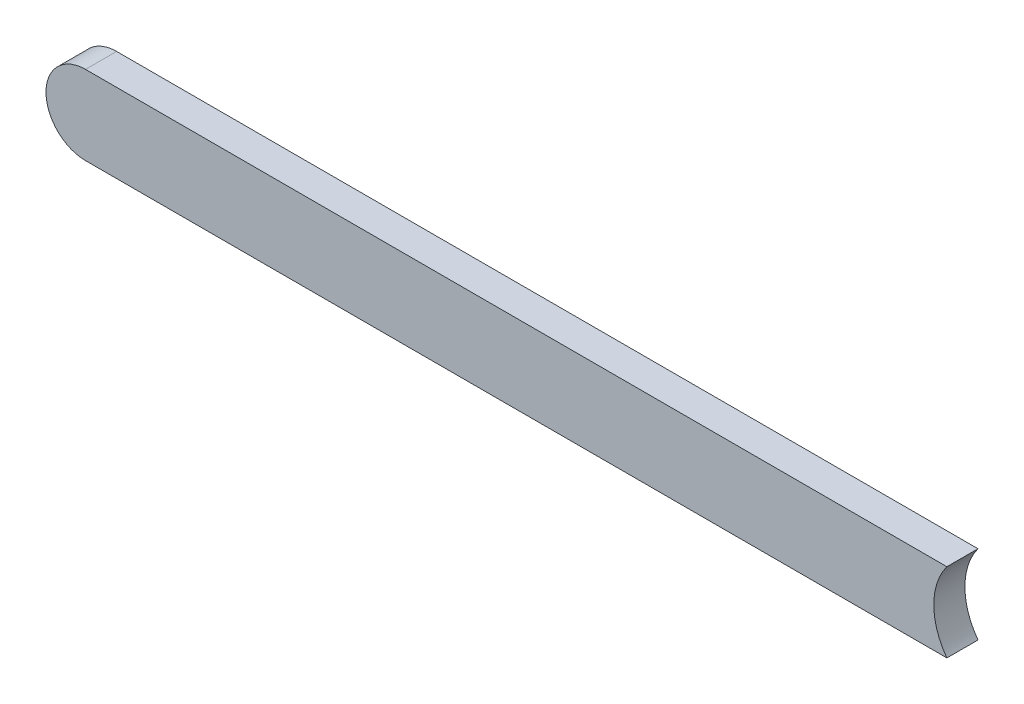
ISO-10303-21;
HEADER;
FILE_DESCRIPTION(('STEP AP214'),'2;1');
FILE_NAME('part.step','',(''),(''),'','','');
FILE_SCHEMA(('AUTOMOTIVE_DESIGN { 1 0 10303 214 1 1 1 1 }'));
ENDSEC;
DATA;
#1=APPLICATION_CONTEXT('core data for automotive mechanical design processes');
#2=APPLICATION_PROTOCOL_DEFINITION('international standard','automotive_design',2000,#1);
#3=PRODUCT_CONTEXT('',#1,'mechanical');
#4=PRODUCT('Part','Part','',(#3));
#5=PRODUCT_RELATED_PRODUCT_CATEGORY('part','',(#4));
#6=PRODUCT_DEFINITION_FORMATION('','',#4);
#7=PRODUCT_DEFINITION_CONTEXT('part definition',#1,'design');
#8=PRODUCT_DEFINITION('design','',#6,#7);
#9=PRODUCT_DEFINITION_SHAPE('','',#8);
#10=(LENGTH_UNIT() NAMED_UNIT(*) SI_UNIT(.MILLI.,.METRE.));
#11=(NAMED_UNIT(*) PLANE_ANGLE_UNIT() SI_UNIT($,.RADIAN.));
#12=(NAMED_UNIT(*) SI_UNIT($,.STERADIAN.) SOLID_ANGLE_UNIT());
#13=UNCERTAINTY_MEASURE_WITH_UNIT(LENGTH_MEASURE(1.E-05),#10,'distance_accuracy_value','');
#14=(GEOMETRIC_REPRESENTATION_CONTEXT(3) GLOBAL_UNCERTAINTY_ASSIGNED_CONTEXT((#13)) GLOBAL_UNIT_ASSIGNED_CONTEXT((#10,
#11,#12)) REPRESENTATION_CONTEXT('',''));
#15=CARTESIAN_POINT('',(0.,0.,0.));
#16=DIRECTION('',(0.,0.,1.));
#17=DIRECTION('',(1.,0.,0.));
#18=AXIS2_PLACEMENT_3D('',#15,#16,#17);
#19=CARTESIAN_POINT('',(143.9814748,58.166,0.));
#20=DIRECTION('',(0.,1.,0.));
#21=DIRECTION('',(1.,0.,0.));
#22=AXIS2_PLACEMENT_3D('',#19,#20,#21);
#23=PLANE('',#22);
#24=DIRECTION('',(1.,0.,0.));
#25=VECTOR('',#24,1.);
#26=CARTESIAN_POINT('',(143.9814748,58.166,0.1999996));
#27=LINE('',#26,#25);
#28=CARTESIAN_POINT('',(143.9814748,58.166,0.1999996));
#29=VERTEX_POINT('',#28);
#30=CARTESIAN_POINT('',(149.519251768896,58.166,0.1999996));
#31=VERTEX_POINT('',#30);
#32=EDGE_CURVE('E11',#29,#31,#27,.T.);
#33=ORIENTED_EDGE('',*,*,#32,.F.);
#34=DIRECTION('',(0.,0.,1.));
#35=VECTOR('',#34,1.);
#36=CARTESIAN_POINT('',(143.9814748,58.166,0.));
#37=LINE('',#36,#35);
#38=CARTESIAN_POINT('',(143.9814748,58.166,0.));
#39=VERTEX_POINT('',#38);
#40=EDGE_CURVE('E24',#39,#29,#37,.T.);
#41=ORIENTED_EDGE('',*,*,#40,.F.);
#42=DIRECTION('',(1.,0.,0.));
#43=VECTOR('',#42,1.);
#44=CARTESIAN_POINT('',(143.9814748,58.166,0.));
#45=LINE('',#44,#43);
#46=CARTESIAN_POINT('',(149.519251768896,58.166,0.));
#47=VERTEX_POINT('',#46);
#48=EDGE_CURVE('E75',#39,#47,#45,.T.);
#49=ORIENTED_EDGE('',*,*,#48,.T.);
#50=DIRECTION('',(0.,0.,1.));
#51=VECTOR('',#50,1.);
#52=CARTESIAN_POINT('',(149.519251768896,58.166,0.));
#53=LINE('',#52,#51);
#54=EDGE_CURVE('E37',#47,#31,#53,.T.);
#55=ORIENTED_EDGE('',*,*,#54,.T.);
#56=EDGE_LOOP('',(#33,#41,#49,#55));
#57=FACE_BOUND('',#56,.T.);
#58=ADVANCED_FACE('F17',(#57),#23,.F.);
#59=CARTESIAN_POINT('',(149.86,58.42,0.));
#60=DIRECTION('',(0.,0.,-1.));
#61=DIRECTION('',(1.,0.,0.));
#62=AXIS2_PLACEMENT_3D('',#59,#60,#61);
#63=CYLINDRICAL_SURFACE('',#62,0.42500042);
#64=DIRECTION('',(0.,0.,1.));
#65=VECTOR('',#64,1.);
#66=CARTESIAN_POINT('',(149.519251768896,58.674,0.));
#67=LINE('',#66,#65);
#68=CARTESIAN_POINT('',(149.519251768896,58.674,0.));
#69=VERTEX_POINT('',#68);
#70=CARTESIAN_POINT('',(149.519251768896,58.674,0.1999996));
#71=VERTEX_POINT('',#70);
#72=EDGE_CURVE('E67',#69,#71,#67,.T.);
#73=ORIENTED_EDGE('',*,*,#72,.T.);
#74=CARTESIAN_POINT('',(149.86,58.42,0.1999996));
#75=DIRECTION('',(0.,0.,1.));
#76=DIRECTION('',(1.,0.,0.));
#77=AXIS2_PLACEMENT_3D('',#74,#75,#76);
#78=CIRCLE('',#77,0.42500042);
#79=EDGE_CURVE('E82',#71,#31,#78,.T.);
#80=ORIENTED_EDGE('',*,*,#79,.T.);
#81=ORIENTED_EDGE('',*,*,#54,.F.);
#82=CARTESIAN_POINT('',(149.86,58.42,0.));
#83=DIRECTION('',(0.,0.,1.));
#84=DIRECTION('',(1.,0.,0.));
#85=AXIS2_PLACEMENT_3D('',#82,#83,#84);
#86=CIRCLE('',#85,0.42500042);
#87=EDGE_CURVE('E80',#69,#47,#86,.T.);
#88=ORIENTED_EDGE('',*,*,#87,.F.);
#89=EDGE_LOOP('',(#73,#80,#81,#88));
#90=FACE_BOUND('',#89,.T.);
#91=ADVANCED_FACE('F88',(#90),#63,.F.);
#92=CARTESIAN_POINT('',(149.519251768896,58.674,0.));
#93=DIRECTION('',(0.,-1.,0.));
#94=DIRECTION('',(-1.,0.,0.));
#95=AXIS2_PLACEMENT_3D('',#92,#93,#94);
#96=PLANE('',#95);
#97=DIRECTION('',(-1.,0.,0.));
#98=VECTOR('',#97,1.);
#99=CARTESIAN_POINT('',(149.86,58.674,0.1999996));
#100=LINE('',#99,#98);
#101=CARTESIAN_POINT('',(143.9814748,58.674,0.1999996));
#102=VERTEX_POINT('',#101);
#103=EDGE_CURVE('E71',#71,#102,#100,.T.);
#104=ORIENTED_EDGE('',*,*,#103,.F.);
#105=ORIENTED_EDGE('',*,*,#72,.F.);
#106=DIRECTION('',(-1.,0.,0.));
#107=VECTOR('',#106,1.);
#108=CARTESIAN_POINT('',(149.86,58.674,0.));
#109=LINE('',#108,#107);
#110=CARTESIAN_POINT('',(143.9814748,58.674,0.));
#111=VERTEX_POINT('',#110);
#112=EDGE_CURVE('E63',#69,#111,#109,.T.);
#113=ORIENTED_EDGE('',*,*,#112,.T.);
#114=DIRECTION('',(0.,0.,1.));
#115=VECTOR('',#114,1.);
#116=CARTESIAN_POINT('',(143.9814748,58.674,0.));
#117=LINE('',#116,#115);
#118=EDGE_CURVE('E53',#111,#102,#117,.T.);
#119=ORIENTED_EDGE('',*,*,#118,.T.);
#120=EDGE_LOOP('',(#104,#105,#113,#119));
#121=FACE_BOUND('',#120,.T.);
#122=ADVANCED_FACE('F66',(#121),#96,.F.);
#123=CARTESIAN_POINT('',(143.9814748,58.42,0.));
#124=DIRECTION('',(0.,0.,-1.));
#125=DIRECTION('',(1.11896493820489E-13,1.,0.));
#126=AXIS2_PLACEMENT_3D('',#123,#124,#125);
#127=CYLINDRICAL_SURFACE('',#126,0.253999999999998);
#128=CARTESIAN_POINT('',(143.9814748,58.42,0.1999996));
#129=DIRECTION('',(0.,0.,1.));
#130=DIRECTION('',(1.11896493820489E-13,1.,0.));
#131=AXIS2_PLACEMENT_3D('',#128,#129,#130);
#132=CIRCLE('',#131,0.253999999999998);
#133=EDGE_CURVE('E59',#102,#29,#132,.T.);
#134=ORIENTED_EDGE('',*,*,#133,.F.);
#135=ORIENTED_EDGE('',*,*,#118,.F.);
#136=CARTESIAN_POINT('',(143.9814748,58.42,0.));
#137=DIRECTION('',(0.,0.,1.));
#138=DIRECTION('',(1.11896493820489E-13,1.,0.));
#139=AXIS2_PLACEMENT_3D('',#136,#137,#138);
#140=CIRCLE('',#139,0.253999999999998);
#141=EDGE_CURVE('E57',#111,#39,#140,.T.);
#142=ORIENTED_EDGE('',*,*,#141,.T.);
#143=ORIENTED_EDGE('',*,*,#40,.T.);
#144=EDGE_LOOP('',(#134,#135,#142,#143));
#145=FACE_BOUND('',#144,.T.);
#146=ADVANCED_FACE('F55',(#145),#127,.T.);
#147=CARTESIAN_POINT('',(143.9814748,58.166,0.));
#148=DIRECTION('',(0.,0.,-1.));
#149=DIRECTION('',(-1.,0.,0.));
#150=AXIS2_PLACEMENT_3D('',#147,#148,#149);
#151=PLANE('',#150);
#152=ORIENTED_EDGE('',*,*,#48,.F.);
#153=ORIENTED_EDGE('',*,*,#141,.F.);
#154=ORIENTED_EDGE('',*,*,#112,.F.);
#155=ORIENTED_EDGE('',*,*,#87,.T.);
#156=EDGE_LOOP('',(#152,#153,#154,#155));
#157=FACE_BOUND('',#156,.T.);
#158=ADVANCED_FACE('F74',(#157),#151,.T.);
#159=CARTESIAN_POINT('',(143.9814748,58.166,0.1999996));
#160=DIRECTION('',(0.,0.,-1.));
#161=DIRECTION('',(-1.,0.,0.));
#162=AXIS2_PLACEMENT_3D('',#159,#160,#161);
#163=PLANE('',#162);
#164=ORIENTED_EDGE('',*,*,#133,.T.);
#165=ORIENTED_EDGE('',*,*,#32,.T.);
#166=ORIENTED_EDGE('',*,*,#79,.F.);
#167=ORIENTED_EDGE('',*,*,#103,.T.);
#168=EDGE_LOOP('',(#164,#165,#166,#167));
#169=FACE_BOUND('',#168,.T.);
#170=ADVANCED_FACE('F91',(#169),#163,.F.);
#171=CLOSED_SHELL('',(#58,#91,#122,#146,#158,#170));
#172=MANIFOLD_SOLID_BREP('B1',#171);
#173=ADVANCED_BREP_SHAPE_REPRESENTATION('',(#18,#172),#14);
#174=SHAPE_DEFINITION_REPRESENTATION(#9,#173);
ENDSEC;
END-ISO-10303-21;
